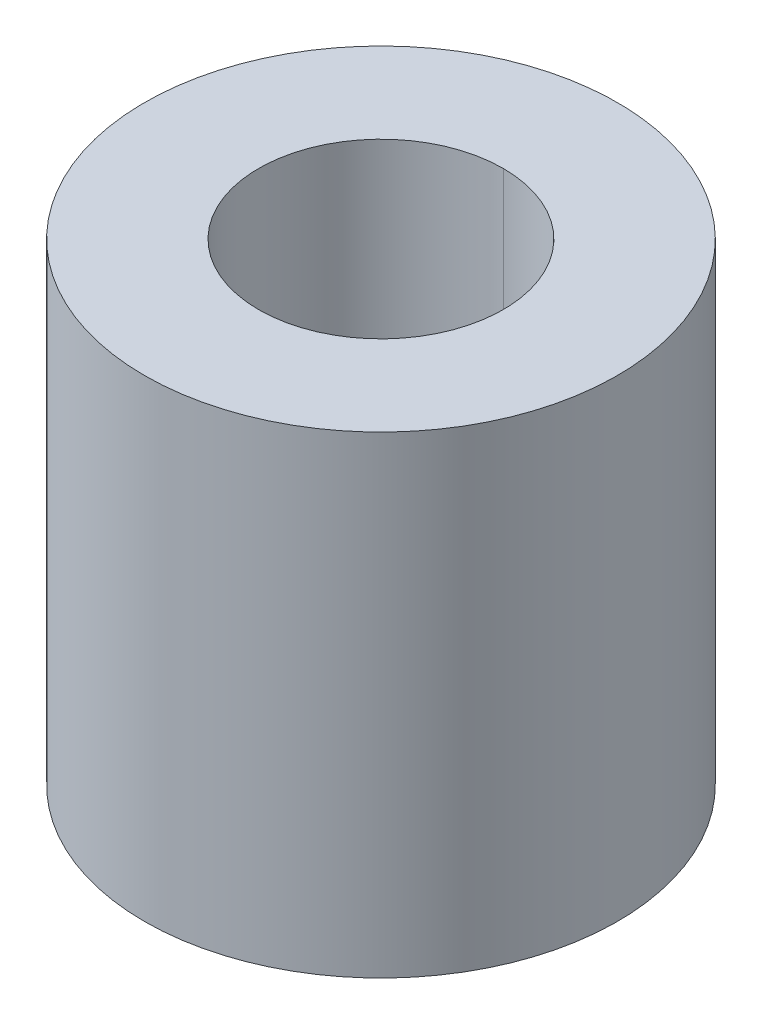
ISO-10303-21;
HEADER;
FILE_DESCRIPTION(('STEP AP214'),'2;1');
FILE_NAME('part.step','',(''),(''),'','','');
FILE_SCHEMA(('AUTOMOTIVE_DESIGN { 1 0 10303 214 1 1 1 1 }'));
ENDSEC;
DATA;
#1=APPLICATION_CONTEXT('core data for automotive mechanical design processes');
#2=APPLICATION_PROTOCOL_DEFINITION('international standard','automotive_design',2000,#1);
#3=PRODUCT_CONTEXT('',#1,'mechanical');
#4=PRODUCT('Part','Part','',(#3));
#5=PRODUCT_RELATED_PRODUCT_CATEGORY('part','',(#4));
#6=PRODUCT_DEFINITION_FORMATION('','',#4);
#7=PRODUCT_DEFINITION_CONTEXT('part definition',#1,'design');
#8=PRODUCT_DEFINITION('design','',#6,#7);
#9=PRODUCT_DEFINITION_SHAPE('','',#8);
#10=(LENGTH_UNIT() NAMED_UNIT(*) SI_UNIT(.MILLI.,.METRE.));
#11=(NAMED_UNIT(*) PLANE_ANGLE_UNIT() SI_UNIT($,.RADIAN.));
#12=(NAMED_UNIT(*) SI_UNIT($,.STERADIAN.) SOLID_ANGLE_UNIT());
#13=UNCERTAINTY_MEASURE_WITH_UNIT(LENGTH_MEASURE(1.E-05),#10,'distance_accuracy_value','');
#14=(GEOMETRIC_REPRESENTATION_CONTEXT(3) GLOBAL_UNCERTAINTY_ASSIGNED_CONTEXT((#13)) GLOBAL_UNIT_ASSIGNED_CONTEXT((#10,
#11,#12)) REPRESENTATION_CONTEXT('',''));
#15=CARTESIAN_POINT('',(0.,0.,0.));
#16=DIRECTION('',(0.,0.,1.));
#17=DIRECTION('',(1.,0.,0.));
#18=AXIS2_PLACEMENT_3D('',#15,#16,#17);
#19=CARTESIAN_POINT('',(0.,-4.7625,0.));
#20=DIRECTION('',(0.,1.,0.));
#21=DIRECTION('',(1.,0.,0.));
#22=AXIS2_PLACEMENT_3D('',#19,#20,#21);
#23=PLANE('',#22);
#24=CARTESIAN_POINT('',(0.,-4.7625,0.));
#25=DIRECTION('',(0.,1.,0.));
#26=DIRECTION('',(0.,0.,1.));
#27=AXIS2_PLACEMENT_3D('',#24,#25,#26);
#28=CIRCLE('',#27,2.4638);
#29=CARTESIAN_POINT('',(0.,-4.7625,-2.4638));
#30=VERTEX_POINT('',#29);
#31=CARTESIAN_POINT('',(0.,-4.7625,2.4638));
#32=VERTEX_POINT('',#31);
#33=EDGE_CURVE('E11',#30,#32,#28,.T.);
#34=ORIENTED_EDGE('',*,*,#33,.T.);
#35=CARTESIAN_POINT('',(0.,-4.7625,0.));
#36=DIRECTION('',(0.,1.,0.));
#37=DIRECTION('',(0.,0.,1.));
#38=AXIS2_PLACEMENT_3D('',#35,#36,#37);
#39=CIRCLE('',#38,2.4638);
#40=EDGE_CURVE('E54',#32,#30,#39,.T.);
#41=ORIENTED_EDGE('',*,*,#40,.T.);
#42=EDGE_LOOP('',(#34,#41));
#43=FACE_BOUND('',#42,.T.);
#44=CARTESIAN_POINT('',(0.,-4.7625,0.));
#45=DIRECTION('',(0.,1.,0.));
#46=DIRECTION('',(0.,0.,1.));
#47=AXIS2_PLACEMENT_3D('',#44,#45,#46);
#48=CIRCLE('',#47,4.7625);
#49=CARTESIAN_POINT('',(0.,-4.7625,4.7625));
#50=VERTEX_POINT('',#49);
#51=EDGE_CURVE('E100',#50,#50,#48,.T.);
#52=ORIENTED_EDGE('',*,*,#51,.F.);
#53=EDGE_LOOP('',(#52));
#54=FACE_BOUND('',#53,.T.);
#55=ADVANCED_FACE('F44',(#43,#54),#23,.F.);
#56=CARTESIAN_POINT('',(0.,4.7625,0.));
#57=DIRECTION('',(0.,1.,0.));
#58=DIRECTION('',(1.,0.,0.));
#59=AXIS2_PLACEMENT_3D('',#56,#57,#58);
#60=PLANE('',#59);
#61=CARTESIAN_POINT('',(0.,4.7625,0.));
#62=DIRECTION('',(0.,1.,0.));
#63=DIRECTION('',(0.,0.,1.));
#64=AXIS2_PLACEMENT_3D('',#61,#62,#63);
#65=CIRCLE('',#64,2.4638);
#66=CARTESIAN_POINT('',(0.,4.7625,-2.4638));
#67=VERTEX_POINT('',#66);
#68=CARTESIAN_POINT('',(0.,4.7625,2.4638));
#69=VERTEX_POINT('',#68);
#70=EDGE_CURVE('E83',#67,#69,#65,.T.);
#71=ORIENTED_EDGE('',*,*,#70,.F.);
#72=CARTESIAN_POINT('',(0.,4.7625,0.));
#73=DIRECTION('',(0.,1.,0.));
#74=DIRECTION('',(0.,0.,1.));
#75=AXIS2_PLACEMENT_3D('',#72,#73,#74);
#76=CIRCLE('',#75,2.4638);
#77=EDGE_CURVE('E88',#69,#67,#76,.T.);
#78=ORIENTED_EDGE('',*,*,#77,.F.);
#79=EDGE_LOOP('',(#71,#78));
#80=FACE_BOUND('',#79,.T.);
#81=CARTESIAN_POINT('',(0.,4.7625,0.));
#82=DIRECTION('',(0.,1.,0.));
#83=DIRECTION('',(0.,0.,1.));
#84=AXIS2_PLACEMENT_3D('',#81,#82,#83);
#85=CIRCLE('',#84,4.7625);
#86=CARTESIAN_POINT('',(0.,4.7625,4.7625));
#87=VERTEX_POINT('',#86);
#88=EDGE_CURVE('E101',#87,#87,#85,.T.);
#89=ORIENTED_EDGE('',*,*,#88,.T.);
#90=EDGE_LOOP('',(#89));
#91=FACE_BOUND('',#90,.T.);
#92=ADVANCED_FACE('F50',(#80,#91),#60,.T.);
#93=CARTESIAN_POINT('',(0.,4.7625,0.));
#94=DIRECTION('',(0.,-1.,0.));
#95=DIRECTION('',(0.,0.,-1.));
#96=AXIS2_PLACEMENT_3D('',#93,#94,#95);
#97=CYLINDRICAL_SURFACE('',#96,2.4638);
#98=DIRECTION('',(0.,-1.,0.));
#99=VECTOR('',#98,1.);
#100=CARTESIAN_POINT('',(0.,4.7625,2.4638));
#101=LINE('',#100,#99);
#102=EDGE_CURVE('E47',#69,#32,#101,.T.);
#103=ORIENTED_EDGE('',*,*,#102,.F.);
#104=ORIENTED_EDGE('',*,*,#77,.T.);
#105=DIRECTION('',(0.,-1.,0.));
#106=VECTOR('',#105,1.);
#107=CARTESIAN_POINT('',(0.,4.7625,-2.4638));
#108=LINE('',#107,#106);
#109=EDGE_CURVE('E76',#67,#30,#108,.T.);
#110=ORIENTED_EDGE('',*,*,#109,.T.);
#111=ORIENTED_EDGE('',*,*,#40,.F.);
#112=EDGE_LOOP('',(#103,#104,#110,#111));
#113=FACE_BOUND('',#112,.T.);
#114=ADVANCED_FACE('F90',(#113),#97,.F.);
#115=CARTESIAN_POINT('',(0.,4.7625,0.));
#116=DIRECTION('',(0.,-1.,0.));
#117=DIRECTION('',(0.,0.,-1.));
#118=AXIS2_PLACEMENT_3D('',#115,#116,#117);
#119=CYLINDRICAL_SURFACE('',#118,2.4638);
#120=ORIENTED_EDGE('',*,*,#70,.T.);
#121=ORIENTED_EDGE('',*,*,#102,.T.);
#122=ORIENTED_EDGE('',*,*,#33,.F.);
#123=ORIENTED_EDGE('',*,*,#109,.F.);
#124=EDGE_LOOP('',(#120,#121,#122,#123));
#125=FACE_BOUND('',#124,.T.);
#126=ADVANCED_FACE('F81',(#125),#119,.F.);
#127=CARTESIAN_POINT('',(0.,-4.7625,0.));
#128=DIRECTION('',(0.,1.,0.));
#129=DIRECTION('',(0.,0.,1.));
#130=AXIS2_PLACEMENT_3D('',#127,#128,#129);
#131=CYLINDRICAL_SURFACE('',#130,4.7625);
#132=CARTESIAN_POINT('',(0.,-4.7625,4.7625));
#133=CARTESIAN_POINT('',(0.,-4.66328125,4.7625));
#134=CARTESIAN_POINT('',(0.,-4.5640625,4.7625));
#135=CARTESIAN_POINT('',(0.,-4.365625,4.7625));
#136=CARTESIAN_POINT('',(0.,-4.26640625,4.7625));
#137=CARTESIAN_POINT('',(0.,-4.06796875,4.7625));
#138=CARTESIAN_POINT('',(0.,-3.96875,4.7625));
#139=CARTESIAN_POINT('',(0.,-3.7703125,4.7625));
#140=CARTESIAN_POINT('',(0.,-3.67109375,4.7625));
#141=CARTESIAN_POINT('',(0.,-3.47265625,4.7625));
#142=CARTESIAN_POINT('',(0.,-3.3734375,4.7625));
#143=CARTESIAN_POINT('',(0.,-3.175,4.7625));
#144=CARTESIAN_POINT('',(0.,-3.07578125,4.7625));
#145=CARTESIAN_POINT('',(0.,-2.87734375,4.7625));
#146=CARTESIAN_POINT('',(0.,-2.778125,4.7625));
#147=CARTESIAN_POINT('',(0.,-2.5796875,4.7625));
#148=CARTESIAN_POINT('',(0.,-2.48046875,4.7625));
#149=CARTESIAN_POINT('',(0.,-2.28203125,4.7625));
#150=CARTESIAN_POINT('',(0.,-2.1828125,4.7625));
#151=CARTESIAN_POINT('',(0.,-1.984375,4.7625));
#152=CARTESIAN_POINT('',(0.,-1.88515625,4.7625));
#153=CARTESIAN_POINT('',(0.,-1.68671875,4.7625));
#154=CARTESIAN_POINT('',(0.,-1.5875,4.7625));
#155=CARTESIAN_POINT('',(0.,-1.3890625,4.7625));
#156=CARTESIAN_POINT('',(0.,-1.28984375,4.7625));
#157=CARTESIAN_POINT('',(0.,-1.09140625,4.7625));
#158=CARTESIAN_POINT('',(0.,-0.9921875,4.7625));
#159=CARTESIAN_POINT('',(0.,-0.79375,4.7625));
#160=CARTESIAN_POINT('',(0.,-0.69453125,4.7625));
#161=CARTESIAN_POINT('',(0.,-0.49609375,4.7625));
#162=CARTESIAN_POINT('',(0.,-0.396875,4.7625));
#163=CARTESIAN_POINT('',(0.,-0.1984375,4.7625));
#164=CARTESIAN_POINT('',(0.,-0.0992187500000001,4.7625));
#165=CARTESIAN_POINT('',(0.,0.0992187500000001,4.7625));
#166=CARTESIAN_POINT('',(0.,0.1984375,4.7625));
#167=CARTESIAN_POINT('',(0.,0.396875,4.7625));
#168=CARTESIAN_POINT('',(0.,0.49609375,4.7625));
#169=CARTESIAN_POINT('',(0.,0.69453125,4.7625));
#170=CARTESIAN_POINT('',(0.,0.793750000000001,4.7625));
#171=CARTESIAN_POINT('',(0.,0.992187500000001,4.7625));
#172=CARTESIAN_POINT('',(0.,1.09140625,4.7625));
#173=CARTESIAN_POINT('',(0.,1.28984375,4.7625));
#174=CARTESIAN_POINT('',(0.,1.3890625,4.7625));
#175=CARTESIAN_POINT('',(0.,1.5875,4.7625));
#176=CARTESIAN_POINT('',(0.,1.68671875,4.7625));
#177=CARTESIAN_POINT('',(0.,1.88515625,4.7625));
#178=CARTESIAN_POINT('',(0.,1.984375,4.7625));
#179=CARTESIAN_POINT('',(0.,2.1828125,4.7625));
#180=CARTESIAN_POINT('',(0.,2.28203125,4.7625));
#181=CARTESIAN_POINT('',(0.,2.48046875,4.7625));
#182=CARTESIAN_POINT('',(0.,2.5796875,4.7625));
#183=CARTESIAN_POINT('',(0.,2.778125,4.7625));
#184=CARTESIAN_POINT('',(0.,2.87734375,4.7625));
#185=CARTESIAN_POINT('',(0.,3.07578125,4.7625));
#186=CARTESIAN_POINT('',(0.,3.175,4.7625));
#187=CARTESIAN_POINT('',(0.,3.3734375,4.7625));
#188=CARTESIAN_POINT('',(0.,3.47265625,4.7625));
#189=CARTESIAN_POINT('',(0.,3.67109375,4.7625));
#190=CARTESIAN_POINT('',(0.,3.7703125,4.7625));
#191=CARTESIAN_POINT('',(0.,3.96875,4.7625));
#192=CARTESIAN_POINT('',(0.,4.06796875,4.7625));
#193=CARTESIAN_POINT('',(0.,4.26640625,4.7625));
#194=CARTESIAN_POINT('',(0.,4.365625,4.7625));
#195=CARTESIAN_POINT('',(0.,4.5640625,4.7625));
#196=CARTESIAN_POINT('',(0.,4.66328125,4.7625));
#197=CARTESIAN_POINT('',(0.,4.7625,4.7625));
#198=B_SPLINE_CURVE_WITH_KNOTS('',3,(#132,#133,#134,#135,#136,#137,#138,#139,#140,#141,#142,
#143,#144,#145,#146,#147,#148,#149,#150,#151,#152,#153,#154,#155,#156,#157,#158,#159,#160,#161,
#162,#163,#164,#165,#166,#167,#168,#169,#170,#171,#172,#173,#174,#175,#176,#177,#178,#179,#180,
#181,#182,#183,#184,#185,#186,#187,#188,#189,#190,#191,#192,#193,#194,#195,#196,#197),
.UNSPECIFIED.,.F.,.F.,(4,2,2,2,2,2,2,2,2,2,2,2,2,2,2,2,2,2,2,2,2,2,2,2,2,2,2,2,2,2,2,2,4),(0.,
0.297656249999999,0.595312499999999,0.89296875,1.190625,1.48828125,1.7859375,2.08359375,2.38125,
2.67890625,2.9765625,3.27421875,3.571875,3.86953125,4.1671875,4.46484375,4.7625,5.06015625,
5.3578125,5.65546875,5.953125,6.25078125,6.5484375,6.84609375,7.14375,7.44140625,7.7390625,
8.03671875,8.334375,8.63203125,8.9296875,9.22734375,9.525),.UNSPECIFIED.);
#199=EDGE_CURVE('BSEAM110',#50,#87,#198,.T.);
#200=ORIENTED_EDGE('',*,*,#51,.T.);
#201=ORIENTED_EDGE('',*,*,#88,.F.);
#202=ORIENTED_EDGE('',*,*,#199,.T.);
#203=ORIENTED_EDGE('',*,*,#199,.F.);
#204=EDGE_LOOP('',(#200,#202,#201,#203));
#205=FACE_BOUND('',#204,.T.);
#206=ADVANCED_FACE('F110',(#205),#131,.T.);
#207=CLOSED_SHELL('',(#55,#92,#114,#126,#206));
#208=MANIFOLD_SOLID_BREP('B2',#207);
#209=ADVANCED_BREP_SHAPE_REPRESENTATION('',(#18,#208),#14);
#210=SHAPE_DEFINITION_REPRESENTATION(#9,#209);
ENDSEC;
END-ISO-10303-21;
